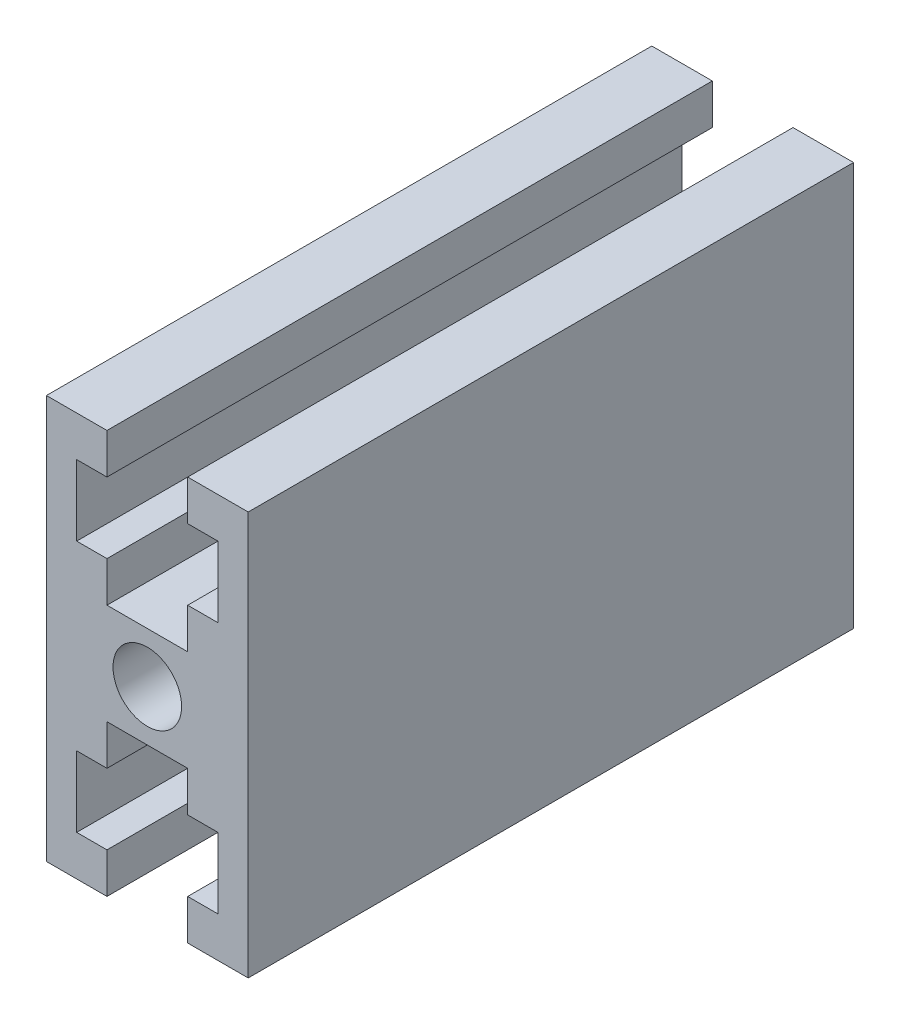
ISO-10303-21;
HEADER;
FILE_DESCRIPTION(('STEP AP214'),'2;1');
FILE_NAME('part.step','',(''),(''),'','','');
FILE_SCHEMA(('AUTOMOTIVE_DESIGN { 1 0 10303 214 1 1 1 1 }'));
ENDSEC;
DATA;
#1=APPLICATION_CONTEXT('core data for automotive mechanical design processes');
#2=APPLICATION_PROTOCOL_DEFINITION('international standard','automotive_design',2000,#1);
#3=PRODUCT_CONTEXT('',#1,'mechanical');
#4=PRODUCT('Part','Part','',(#3));
#5=PRODUCT_RELATED_PRODUCT_CATEGORY('part','',(#4));
#6=PRODUCT_DEFINITION_FORMATION('','',#4);
#7=PRODUCT_DEFINITION_CONTEXT('part definition',#1,'design');
#8=PRODUCT_DEFINITION('design','',#6,#7);
#9=PRODUCT_DEFINITION_SHAPE('','',#8);
#10=(LENGTH_UNIT() NAMED_UNIT(*) SI_UNIT(.MILLI.,.METRE.));
#11=(NAMED_UNIT(*) PLANE_ANGLE_UNIT() SI_UNIT($,.RADIAN.));
#12=(NAMED_UNIT(*) SI_UNIT($,.STERADIAN.) SOLID_ANGLE_UNIT());
#13=UNCERTAINTY_MEASURE_WITH_UNIT(LENGTH_MEASURE(1.E-05),#10,'distance_accuracy_value','');
#14=(GEOMETRIC_REPRESENTATION_CONTEXT(3) GLOBAL_UNCERTAINTY_ASSIGNED_CONTEXT((#13)) GLOBAL_UNIT_ASSIGNED_CONTEXT((#10,
#11,#12)) REPRESENTATION_CONTEXT('',''));
#15=CARTESIAN_POINT('',(0.,0.,0.));
#16=DIRECTION('',(0.,0.,1.));
#17=DIRECTION('',(1.,0.,0.));
#18=AXIS2_PLACEMENT_3D('',#15,#16,#17);
#19=CARTESIAN_POINT('',(0.,0.,60.));
#20=DIRECTION('',(0.,0.,1.));
#21=DIRECTION('',(1.,0.,0.));
#22=AXIS2_PLACEMENT_3D('',#19,#20,#21);
#23=PLANE('',#22);
#24=DIRECTION('',(0.,-1.,0.));
#25=VECTOR('',#24,1.);
#26=CARTESIAN_POINT('',(0.,0.,60.));
#27=LINE('',#26,#25);
#28=CARTESIAN_POINT('',(0.,0.,60.));
#29=VERTEX_POINT('',#28);
#30=CARTESIAN_POINT('',(0.,-40.,60.));
#31=VERTEX_POINT('',#30);
#32=EDGE_CURVE('E305',#29,#31,#27,.T.);
#33=ORIENTED_EDGE('',*,*,#32,.T.);
#34=DIRECTION('',(1.,0.,0.));
#35=VECTOR('',#34,1.);
#36=CARTESIAN_POINT('',(0.,-40.,60.));
#37=LINE('',#36,#35);
#38=CARTESIAN_POINT('',(6.,-40.,60.));
#39=VERTEX_POINT('',#38);
#40=EDGE_CURVE('E153',#31,#39,#37,.T.);
#41=ORIENTED_EDGE('',*,*,#40,.T.);
#42=DIRECTION('',(0.,1.,0.));
#43=VECTOR('',#42,1.);
#44=CARTESIAN_POINT('',(6.,-40.,60.));
#45=LINE('',#44,#43);
#46=CARTESIAN_POINT('',(6.,-36.,60.));
#47=VERTEX_POINT('',#46);
#48=EDGE_CURVE('E380',#39,#47,#45,.T.);
#49=ORIENTED_EDGE('',*,*,#48,.T.);
#50=DIRECTION('',(-1.,0.,0.));
#51=VECTOR('',#50,1.);
#52=CARTESIAN_POINT('',(6.,-36.,60.));
#53=LINE('',#52,#51);
#54=CARTESIAN_POINT('',(3.,-36.,60.));
#55=VERTEX_POINT('',#54);
#56=EDGE_CURVE('E399',#47,#55,#53,.T.);
#57=ORIENTED_EDGE('',*,*,#56,.T.);
#58=DIRECTION('',(0.,1.,0.));
#59=VECTOR('',#58,1.);
#60=CARTESIAN_POINT('',(3.,-36.,60.));
#61=LINE('',#60,#59);
#62=CARTESIAN_POINT('',(3.,-29.,60.));
#63=VERTEX_POINT('',#62);
#64=EDGE_CURVE('E396',#55,#63,#61,.T.);
#65=ORIENTED_EDGE('',*,*,#64,.T.);
#66=DIRECTION('',(1.,0.,0.));
#67=VECTOR('',#66,1.);
#68=CARTESIAN_POINT('',(3.,-29.,60.));
#69=LINE('',#68,#67);
#70=CARTESIAN_POINT('',(6.,-29.,60.));
#71=VERTEX_POINT('',#70);
#72=EDGE_CURVE('E398',#63,#71,#69,.T.);
#73=ORIENTED_EDGE('',*,*,#72,.T.);
#74=DIRECTION('',(0.,1.,0.));
#75=VECTOR('',#74,1.);
#76=CARTESIAN_POINT('',(6.,-29.,60.));
#77=LINE('',#76,#75);
#78=CARTESIAN_POINT('',(6.,-25.,60.));
#79=VERTEX_POINT('',#78);
#80=EDGE_CURVE('E401',#71,#79,#77,.T.);
#81=ORIENTED_EDGE('',*,*,#80,.T.);
#82=DIRECTION('',(1.,0.,0.));
#83=VECTOR('',#82,1.);
#84=CARTESIAN_POINT('',(6.,-25.,60.));
#85=LINE('',#84,#83);
#86=CARTESIAN_POINT('',(14.,-25.,60.));
#87=VERTEX_POINT('',#86);
#88=EDGE_CURVE('E407',#79,#87,#85,.T.);
#89=ORIENTED_EDGE('',*,*,#88,.T.);
#90=DIRECTION('',(0.,-1.,0.));
#91=VECTOR('',#90,1.);
#92=CARTESIAN_POINT('',(14.,-25.,60.));
#93=LINE('',#92,#91);
#94=CARTESIAN_POINT('',(14.,-29.,60.));
#95=VERTEX_POINT('',#94);
#96=EDGE_CURVE('E409',#87,#95,#93,.T.);
#97=ORIENTED_EDGE('',*,*,#96,.T.);
#98=DIRECTION('',(1.,0.,0.));
#99=VECTOR('',#98,1.);
#100=CARTESIAN_POINT('',(14.,-29.,60.));
#101=LINE('',#100,#99);
#102=CARTESIAN_POINT('',(17.,-29.,60.));
#103=VERTEX_POINT('',#102);
#104=EDGE_CURVE('E411',#95,#103,#101,.T.);
#105=ORIENTED_EDGE('',*,*,#104,.T.);
#106=DIRECTION('',(0.,-1.,0.));
#107=VECTOR('',#106,1.);
#108=CARTESIAN_POINT('',(17.,-29.,60.));
#109=LINE('',#108,#107);
#110=CARTESIAN_POINT('',(17.,-36.,60.));
#111=VERTEX_POINT('',#110);
#112=EDGE_CURVE('E413',#103,#111,#109,.T.);
#113=ORIENTED_EDGE('',*,*,#112,.T.);
#114=DIRECTION('',(-1.,0.,0.));
#115=VECTOR('',#114,1.);
#116=CARTESIAN_POINT('',(17.,-36.,60.));
#117=LINE('',#116,#115);
#118=CARTESIAN_POINT('',(14.,-36.,60.));
#119=VERTEX_POINT('',#118);
#120=EDGE_CURVE('E415',#111,#119,#117,.T.);
#121=ORIENTED_EDGE('',*,*,#120,.T.);
#122=DIRECTION('',(0.,-1.,0.));
#123=VECTOR('',#122,1.);
#124=CARTESIAN_POINT('',(14.,-36.,60.));
#125=LINE('',#124,#123);
#126=CARTESIAN_POINT('',(14.,-40.,60.));
#127=VERTEX_POINT('',#126);
#128=EDGE_CURVE('E417',#119,#127,#125,.T.);
#129=ORIENTED_EDGE('',*,*,#128,.T.);
#130=DIRECTION('',(1.,0.,0.));
#131=VECTOR('',#130,1.);
#132=CARTESIAN_POINT('',(14.,-40.,60.));
#133=LINE('',#132,#131);
#134=CARTESIAN_POINT('',(20.,-40.,60.));
#135=VERTEX_POINT('',#134);
#136=EDGE_CURVE('E419',#127,#135,#133,.T.);
#137=ORIENTED_EDGE('',*,*,#136,.T.);
#138=DIRECTION('',(0.,1.,0.));
#139=VECTOR('',#138,1.);
#140=CARTESIAN_POINT('',(20.,0.,60.));
#141=LINE('',#140,#139);
#142=CARTESIAN_POINT('',(20.,0.,60.));
#143=VERTEX_POINT('',#142);
#144=EDGE_CURVE('E421',#135,#143,#141,.T.);
#145=ORIENTED_EDGE('',*,*,#144,.T.);
#146=DIRECTION('',(-1.,0.,0.));
#147=VECTOR('',#146,1.);
#148=CARTESIAN_POINT('',(14.,0.,60.));
#149=LINE('',#148,#147);
#150=CARTESIAN_POINT('',(14.,0.,60.));
#151=VERTEX_POINT('',#150);
#152=EDGE_CURVE('E423',#143,#151,#149,.T.);
#153=ORIENTED_EDGE('',*,*,#152,.T.);
#154=DIRECTION('',(0.,-1.,0.));
#155=VECTOR('',#154,1.);
#156=CARTESIAN_POINT('',(14.,-4.,60.));
#157=LINE('',#156,#155);
#158=CARTESIAN_POINT('',(14.,-4.,60.));
#159=VERTEX_POINT('',#158);
#160=EDGE_CURVE('E425',#151,#159,#157,.T.);
#161=ORIENTED_EDGE('',*,*,#160,.T.);
#162=DIRECTION('',(1.,0.,0.));
#163=VECTOR('',#162,1.);
#164=CARTESIAN_POINT('',(17.,-4.,60.));
#165=LINE('',#164,#163);
#166=CARTESIAN_POINT('',(17.,-4.,60.));
#167=VERTEX_POINT('',#166);
#168=EDGE_CURVE('E427',#159,#167,#165,.T.);
#169=ORIENTED_EDGE('',*,*,#168,.T.);
#170=DIRECTION('',(0.,-1.,0.));
#171=VECTOR('',#170,1.);
#172=CARTESIAN_POINT('',(17.,-11.,60.));
#173=LINE('',#172,#171);
#174=CARTESIAN_POINT('',(17.,-11.,60.));
#175=VERTEX_POINT('',#174);
#176=EDGE_CURVE('E429',#167,#175,#173,.T.);
#177=ORIENTED_EDGE('',*,*,#176,.T.);
#178=DIRECTION('',(-1.,0.,0.));
#179=VECTOR('',#178,1.);
#180=CARTESIAN_POINT('',(14.,-11.,60.));
#181=LINE('',#180,#179);
#182=CARTESIAN_POINT('',(14.,-11.,60.));
#183=VERTEX_POINT('',#182);
#184=EDGE_CURVE('E431',#175,#183,#181,.T.);
#185=ORIENTED_EDGE('',*,*,#184,.T.);
#186=DIRECTION('',(0.,-1.,0.));
#187=VECTOR('',#186,1.);
#188=CARTESIAN_POINT('',(14.,-15.,60.));
#189=LINE('',#188,#187);
#190=CARTESIAN_POINT('',(14.,-15.,60.));
#191=VERTEX_POINT('',#190);
#192=EDGE_CURVE('E433',#183,#191,#189,.T.);
#193=ORIENTED_EDGE('',*,*,#192,.T.);
#194=DIRECTION('',(-1.,0.,0.));
#195=VECTOR('',#194,1.);
#196=CARTESIAN_POINT('',(6.,-15.,60.));
#197=LINE('',#196,#195);
#198=CARTESIAN_POINT('',(6.,-15.,60.));
#199=VERTEX_POINT('',#198);
#200=EDGE_CURVE('E435',#191,#199,#197,.T.);
#201=ORIENTED_EDGE('',*,*,#200,.T.);
#202=DIRECTION('',(0.,1.,0.));
#203=VECTOR('',#202,1.);
#204=CARTESIAN_POINT('',(6.,-11.,60.));
#205=LINE('',#204,#203);
#206=CARTESIAN_POINT('',(6.,-11.,60.));
#207=VERTEX_POINT('',#206);
#208=EDGE_CURVE('E437',#199,#207,#205,.T.);
#209=ORIENTED_EDGE('',*,*,#208,.T.);
#210=DIRECTION('',(-1.,0.,0.));
#211=VECTOR('',#210,1.);
#212=CARTESIAN_POINT('',(3.,-11.,60.));
#213=LINE('',#212,#211);
#214=CARTESIAN_POINT('',(3.,-11.,60.));
#215=VERTEX_POINT('',#214);
#216=EDGE_CURVE('E439',#207,#215,#213,.T.);
#217=ORIENTED_EDGE('',*,*,#216,.T.);
#218=DIRECTION('',(0.,1.,0.));
#219=VECTOR('',#218,1.);
#220=CARTESIAN_POINT('',(3.,-4.,60.));
#221=LINE('',#220,#219);
#222=CARTESIAN_POINT('',(3.,-4.,60.));
#223=VERTEX_POINT('',#222);
#224=EDGE_CURVE('E232',#215,#223,#221,.T.);
#225=ORIENTED_EDGE('',*,*,#224,.T.);
#226=DIRECTION('',(1.,0.,0.));
#227=VECTOR('',#226,1.);
#228=CARTESIAN_POINT('',(6.,-4.,60.));
#229=LINE('',#228,#227);
#230=CARTESIAN_POINT('',(6.,-4.,60.));
#231=VERTEX_POINT('',#230);
#232=EDGE_CURVE('E226',#223,#231,#229,.T.);
#233=ORIENTED_EDGE('',*,*,#232,.T.);
#234=DIRECTION('',(0.,1.,0.));
#235=VECTOR('',#234,1.);
#236=CARTESIAN_POINT('',(6.,0.,60.));
#237=LINE('',#236,#235);
#238=CARTESIAN_POINT('',(6.,0.,60.));
#239=VERTEX_POINT('',#238);
#240=EDGE_CURVE('E230',#231,#239,#237,.T.);
#241=ORIENTED_EDGE('',*,*,#240,.T.);
#242=DIRECTION('',(-1.,0.,0.));
#243=VECTOR('',#242,1.);
#244=CARTESIAN_POINT('',(0.,0.,60.));
#245=LINE('',#244,#243);
#246=EDGE_CURVE('E50',#239,#29,#245,.T.);
#247=ORIENTED_EDGE('',*,*,#246,.T.);
#248=EDGE_LOOP('',(#33,#41,#49,#57,#65,#73,#81,#89,#97,#105,#113,#121,#129,#137,#145,#153,#161,
#169,#177,#185,#193,#201,#209,#217,#225,#233,#241,#247));
#249=FACE_BOUND('',#248,.T.);
#250=CARTESIAN_POINT('',(10.,-20.,60.));
#251=DIRECTION('',(0.,0.,1.));
#252=DIRECTION('',(-1.,0.,0.));
#253=AXIS2_PLACEMENT_3D('',#250,#251,#252);
#254=CIRCLE('',#253,3.4);
#255=CARTESIAN_POINT('',(6.6,-20.,60.));
#256=VERTEX_POINT('',#255);
#257=EDGE_CURVE('E254',#256,#256,#254,.T.);
#258=ORIENTED_EDGE('',*,*,#257,.F.);
#259=EDGE_LOOP('',(#258));
#260=FACE_BOUND('',#259,.T.);
#261=ADVANCED_FACE('F33',(#249,#260),#23,.T.);
#262=CARTESIAN_POINT('',(0.,0.,0.));
#263=DIRECTION('',(0.,0.,1.));
#264=DIRECTION('',(1.,0.,0.));
#265=AXIS2_PLACEMENT_3D('',#262,#263,#264);
#266=PLANE('',#265);
#267=DIRECTION('',(0.,-1.,0.));
#268=VECTOR('',#267,1.);
#269=CARTESIAN_POINT('',(0.,0.,0.));
#270=LINE('',#269,#268);
#271=CARTESIAN_POINT('',(0.,0.,0.));
#272=VERTEX_POINT('',#271);
#273=CARTESIAN_POINT('',(0.,-40.,0.));
#274=VERTEX_POINT('',#273);
#275=EDGE_CURVE('E250',#272,#274,#270,.T.);
#276=ORIENTED_EDGE('',*,*,#275,.F.);
#277=DIRECTION('',(-1.,0.,0.));
#278=VECTOR('',#277,1.);
#279=CARTESIAN_POINT('',(0.,0.,0.));
#280=LINE('',#279,#278);
#281=CARTESIAN_POINT('',(6.,0.,0.));
#282=VERTEX_POINT('',#281);
#283=EDGE_CURVE('E145',#282,#272,#280,.T.);
#284=ORIENTED_EDGE('',*,*,#283,.F.);
#285=DIRECTION('',(0.,1.,0.));
#286=VECTOR('',#285,1.);
#287=CARTESIAN_POINT('',(6.,0.,0.));
#288=LINE('',#287,#286);
#289=CARTESIAN_POINT('',(6.,-4.,0.));
#290=VERTEX_POINT('',#289);
#291=EDGE_CURVE('E139',#290,#282,#288,.T.);
#292=ORIENTED_EDGE('',*,*,#291,.F.);
#293=DIRECTION('',(1.,0.,0.));
#294=VECTOR('',#293,1.);
#295=CARTESIAN_POINT('',(6.,-4.,0.));
#296=LINE('',#295,#294);
#297=CARTESIAN_POINT('',(3.,-4.,0.));
#298=VERTEX_POINT('',#297);
#299=EDGE_CURVE('E240',#298,#290,#296,.T.);
#300=ORIENTED_EDGE('',*,*,#299,.F.);
#301=DIRECTION('',(0.,1.,0.));
#302=VECTOR('',#301,1.);
#303=CARTESIAN_POINT('',(3.,-4.,0.));
#304=LINE('',#303,#302);
#305=CARTESIAN_POINT('',(3.,-11.,0.));
#306=VERTEX_POINT('',#305);
#307=EDGE_CURVE('E300',#306,#298,#304,.T.);
#308=ORIENTED_EDGE('',*,*,#307,.F.);
#309=DIRECTION('',(-1.,0.,0.));
#310=VECTOR('',#309,1.);
#311=CARTESIAN_POINT('',(3.,-11.,0.));
#312=LINE('',#311,#310);
#313=CARTESIAN_POINT('',(6.,-11.,0.));
#314=VERTEX_POINT('',#313);
#315=EDGE_CURVE('E298',#314,#306,#312,.T.);
#316=ORIENTED_EDGE('',*,*,#315,.F.);
#317=DIRECTION('',(0.,1.,0.));
#318=VECTOR('',#317,1.);
#319=CARTESIAN_POINT('',(6.,-11.,0.));
#320=LINE('',#319,#318);
#321=CARTESIAN_POINT('',(6.,-15.,0.));
#322=VERTEX_POINT('',#321);
#323=EDGE_CURVE('E296',#322,#314,#320,.T.);
#324=ORIENTED_EDGE('',*,*,#323,.F.);
#325=DIRECTION('',(-1.,0.,0.));
#326=VECTOR('',#325,1.);
#327=CARTESIAN_POINT('',(6.,-15.,0.));
#328=LINE('',#327,#326);
#329=CARTESIAN_POINT('',(14.,-15.,0.));
#330=VERTEX_POINT('',#329);
#331=EDGE_CURVE('E294',#330,#322,#328,.T.);
#332=ORIENTED_EDGE('',*,*,#331,.F.);
#333=DIRECTION('',(0.,-1.,0.));
#334=VECTOR('',#333,1.);
#335=CARTESIAN_POINT('',(14.,-15.,0.));
#336=LINE('',#335,#334);
#337=CARTESIAN_POINT('',(14.,-11.,0.));
#338=VERTEX_POINT('',#337);
#339=EDGE_CURVE('E292',#338,#330,#336,.T.);
#340=ORIENTED_EDGE('',*,*,#339,.F.);
#341=DIRECTION('',(-1.,0.,0.));
#342=VECTOR('',#341,1.);
#343=CARTESIAN_POINT('',(14.,-11.,0.));
#344=LINE('',#343,#342);
#345=CARTESIAN_POINT('',(17.,-11.,0.));
#346=VERTEX_POINT('',#345);
#347=EDGE_CURVE('E290',#346,#338,#344,.T.);
#348=ORIENTED_EDGE('',*,*,#347,.F.);
#349=DIRECTION('',(0.,-1.,0.));
#350=VECTOR('',#349,1.);
#351=CARTESIAN_POINT('',(17.,-11.,0.));
#352=LINE('',#351,#350);
#353=CARTESIAN_POINT('',(17.,-4.,0.));
#354=VERTEX_POINT('',#353);
#355=EDGE_CURVE('E288',#354,#346,#352,.T.);
#356=ORIENTED_EDGE('',*,*,#355,.F.);
#357=DIRECTION('',(1.,0.,0.));
#358=VECTOR('',#357,1.);
#359=CARTESIAN_POINT('',(17.,-4.,0.));
#360=LINE('',#359,#358);
#361=CARTESIAN_POINT('',(14.,-4.,0.));
#362=VERTEX_POINT('',#361);
#363=EDGE_CURVE('E286',#362,#354,#360,.T.);
#364=ORIENTED_EDGE('',*,*,#363,.F.);
#365=DIRECTION('',(0.,-1.,0.));
#366=VECTOR('',#365,1.);
#367=CARTESIAN_POINT('',(14.,-4.,0.));
#368=LINE('',#367,#366);
#369=CARTESIAN_POINT('',(14.,0.,0.));
#370=VERTEX_POINT('',#369);
#371=EDGE_CURVE('E284',#370,#362,#368,.T.);
#372=ORIENTED_EDGE('',*,*,#371,.F.);
#373=DIRECTION('',(-1.,0.,0.));
#374=VECTOR('',#373,1.);
#375=CARTESIAN_POINT('',(14.,0.,0.));
#376=LINE('',#375,#374);
#377=CARTESIAN_POINT('',(20.,0.,0.));
#378=VERTEX_POINT('',#377);
#379=EDGE_CURVE('E282',#378,#370,#376,.T.);
#380=ORIENTED_EDGE('',*,*,#379,.F.);
#381=DIRECTION('',(0.,1.,0.));
#382=VECTOR('',#381,1.);
#383=CARTESIAN_POINT('',(20.,0.,0.));
#384=LINE('',#383,#382);
#385=CARTESIAN_POINT('',(20.,-40.,0.));
#386=VERTEX_POINT('',#385);
#387=EDGE_CURVE('E280',#386,#378,#384,.T.);
#388=ORIENTED_EDGE('',*,*,#387,.F.);
#389=DIRECTION('',(1.,0.,0.));
#390=VECTOR('',#389,1.);
#391=CARTESIAN_POINT('',(14.,-40.,0.));
#392=LINE('',#391,#390);
#393=CARTESIAN_POINT('',(14.,-40.,0.));
#394=VERTEX_POINT('',#393);
#395=EDGE_CURVE('E278',#394,#386,#392,.T.);
#396=ORIENTED_EDGE('',*,*,#395,.F.);
#397=DIRECTION('',(0.,-1.,0.));
#398=VECTOR('',#397,1.);
#399=CARTESIAN_POINT('',(14.,-36.,0.));
#400=LINE('',#399,#398);
#401=CARTESIAN_POINT('',(14.,-36.,0.));
#402=VERTEX_POINT('',#401);
#403=EDGE_CURVE('E276',#402,#394,#400,.T.);
#404=ORIENTED_EDGE('',*,*,#403,.F.);
#405=DIRECTION('',(-1.,0.,0.));
#406=VECTOR('',#405,1.);
#407=CARTESIAN_POINT('',(17.,-36.,0.));
#408=LINE('',#407,#406);
#409=CARTESIAN_POINT('',(17.,-36.,0.));
#410=VERTEX_POINT('',#409);
#411=EDGE_CURVE('E274',#410,#402,#408,.T.);
#412=ORIENTED_EDGE('',*,*,#411,.F.);
#413=DIRECTION('',(0.,-1.,0.));
#414=VECTOR('',#413,1.);
#415=CARTESIAN_POINT('',(17.,-29.,0.));
#416=LINE('',#415,#414);
#417=CARTESIAN_POINT('',(17.,-29.,0.));
#418=VERTEX_POINT('',#417);
#419=EDGE_CURVE('E272',#418,#410,#416,.T.);
#420=ORIENTED_EDGE('',*,*,#419,.F.);
#421=DIRECTION('',(1.,0.,0.));
#422=VECTOR('',#421,1.);
#423=CARTESIAN_POINT('',(14.,-29.,0.));
#424=LINE('',#423,#422);
#425=CARTESIAN_POINT('',(14.,-29.,0.));
#426=VERTEX_POINT('',#425);
#427=EDGE_CURVE('E270',#426,#418,#424,.T.);
#428=ORIENTED_EDGE('',*,*,#427,.F.);
#429=DIRECTION('',(0.,-1.,0.));
#430=VECTOR('',#429,1.);
#431=CARTESIAN_POINT('',(14.,-25.,0.));
#432=LINE('',#431,#430);
#433=CARTESIAN_POINT('',(14.,-25.,0.));
#434=VERTEX_POINT('',#433);
#435=EDGE_CURVE('E268',#434,#426,#432,.T.);
#436=ORIENTED_EDGE('',*,*,#435,.F.);
#437=DIRECTION('',(1.,0.,0.));
#438=VECTOR('',#437,1.);
#439=CARTESIAN_POINT('',(6.,-25.,0.));
#440=LINE('',#439,#438);
#441=CARTESIAN_POINT('',(6.,-25.,0.));
#442=VERTEX_POINT('',#441);
#443=EDGE_CURVE('E266',#442,#434,#440,.T.);
#444=ORIENTED_EDGE('',*,*,#443,.F.);
#445=DIRECTION('',(0.,1.,0.));
#446=VECTOR('',#445,1.);
#447=CARTESIAN_POINT('',(6.,-29.,0.));
#448=LINE('',#447,#446);
#449=CARTESIAN_POINT('',(6.,-29.,0.));
#450=VERTEX_POINT('',#449);
#451=EDGE_CURVE('E264',#450,#442,#448,.T.);
#452=ORIENTED_EDGE('',*,*,#451,.F.);
#453=DIRECTION('',(1.,0.,0.));
#454=VECTOR('',#453,1.);
#455=CARTESIAN_POINT('',(3.,-29.,0.));
#456=LINE('',#455,#454);
#457=CARTESIAN_POINT('',(3.,-29.,0.));
#458=VERTEX_POINT('',#457);
#459=EDGE_CURVE('E262',#458,#450,#456,.T.);
#460=ORIENTED_EDGE('',*,*,#459,.F.);
#461=DIRECTION('',(0.,1.,0.));
#462=VECTOR('',#461,1.);
#463=CARTESIAN_POINT('',(3.,-36.,0.));
#464=LINE('',#463,#462);
#465=CARTESIAN_POINT('',(3.,-36.,0.));
#466=VERTEX_POINT('',#465);
#467=EDGE_CURVE('E260',#466,#458,#464,.T.);
#468=ORIENTED_EDGE('',*,*,#467,.F.);
#469=DIRECTION('',(-1.,0.,0.));
#470=VECTOR('',#469,1.);
#471=CARTESIAN_POINT('',(6.,-36.,0.));
#472=LINE('',#471,#470);
#473=CARTESIAN_POINT('',(6.,-36.,0.));
#474=VERTEX_POINT('',#473);
#475=EDGE_CURVE('E258',#474,#466,#472,.T.);
#476=ORIENTED_EDGE('',*,*,#475,.F.);
#477=DIRECTION('',(0.,1.,0.));
#478=VECTOR('',#477,1.);
#479=CARTESIAN_POINT('',(6.,-40.,0.));
#480=LINE('',#479,#478);
#481=CARTESIAN_POINT('',(6.,-40.,0.));
#482=VERTEX_POINT('',#481);
#483=EDGE_CURVE('E256',#482,#474,#480,.T.);
#484=ORIENTED_EDGE('',*,*,#483,.F.);
#485=DIRECTION('',(1.,0.,0.));
#486=VECTOR('',#485,1.);
#487=CARTESIAN_POINT('',(0.,-40.,0.));
#488=LINE('',#487,#486);
#489=EDGE_CURVE('E253',#274,#482,#488,.T.);
#490=ORIENTED_EDGE('',*,*,#489,.F.);
#491=EDGE_LOOP('',(#276,#284,#292,#300,#308,#316,#324,#332,#340,#348,#356,#364,#372,#380,#388,
#396,#404,#412,#420,#428,#436,#444,#452,#460,#468,#476,#484,#490));
#492=FACE_BOUND('',#491,.T.);
#493=CARTESIAN_POINT('',(10.,-20.,0.));
#494=DIRECTION('',(0.,0.,1.));
#495=DIRECTION('',(-1.,0.,0.));
#496=AXIS2_PLACEMENT_3D('',#493,#494,#495);
#497=CIRCLE('',#496,3.4);
#498=CARTESIAN_POINT('',(6.6,-20.,0.));
#499=VERTEX_POINT('',#498);
#500=EDGE_CURVE('E794',#499,#499,#497,.T.);
#501=ORIENTED_EDGE('',*,*,#500,.T.);
#502=EDGE_LOOP('',(#501));
#503=FACE_BOUND('',#502,.T.);
#504=ADVANCED_FACE('F384',(#492,#503),#266,.F.);
#505=CARTESIAN_POINT('',(0.,0.,60.));
#506=DIRECTION('',(1.,0.,0.));
#507=DIRECTION('',(0.,0.,-1.));
#508=AXIS2_PLACEMENT_3D('',#505,#506,#507);
#509=PLANE('',#508);
#510=ORIENTED_EDGE('',*,*,#275,.T.);
#511=DIRECTION('',(0.,0.,-1.));
#512=VECTOR('',#511,1.);
#513=CARTESIAN_POINT('',(0.,-40.,60.));
#514=LINE('',#513,#512);
#515=EDGE_CURVE('E11',#31,#274,#514,.T.);
#516=ORIENTED_EDGE('',*,*,#515,.F.);
#517=ORIENTED_EDGE('',*,*,#32,.F.);
#518=DIRECTION('',(0.,0.,-1.));
#519=VECTOR('',#518,1.);
#520=CARTESIAN_POINT('',(0.,0.,60.));
#521=LINE('',#520,#519);
#522=EDGE_CURVE('E246',#29,#272,#521,.T.);
#523=ORIENTED_EDGE('',*,*,#522,.T.);
#524=EDGE_LOOP('',(#510,#516,#517,#523));
#525=FACE_BOUND('',#524,.T.);
#526=ADVANCED_FACE('F35',(#525),#509,.F.);
#527=CARTESIAN_POINT('',(0.,-40.,60.));
#528=DIRECTION('',(0.,1.,0.));
#529=DIRECTION('',(0.,0.,1.));
#530=AXIS2_PLACEMENT_3D('',#527,#528,#529);
#531=PLANE('',#530);
#532=ORIENTED_EDGE('',*,*,#489,.T.);
#533=DIRECTION('',(0.,0.,-1.));
#534=VECTOR('',#533,1.);
#535=CARTESIAN_POINT('',(6.,-40.,60.));
#536=LINE('',#535,#534);
#537=EDGE_CURVE('E42',#39,#482,#536,.T.);
#538=ORIENTED_EDGE('',*,*,#537,.F.);
#539=ORIENTED_EDGE('',*,*,#40,.F.);
#540=ORIENTED_EDGE('',*,*,#515,.T.);
#541=EDGE_LOOP('',(#532,#538,#539,#540));
#542=FACE_BOUND('',#541,.T.);
#543=ADVANCED_FACE('F473',(#542),#531,.F.);
#544=CARTESIAN_POINT('',(6.,-40.,60.));
#545=DIRECTION('',(-1.,0.,0.));
#546=DIRECTION('',(0.,0.,1.));
#547=AXIS2_PLACEMENT_3D('',#544,#545,#546);
#548=PLANE('',#547);
#549=ORIENTED_EDGE('',*,*,#483,.T.);
#550=DIRECTION('',(0.,0.,-1.));
#551=VECTOR('',#550,1.);
#552=CARTESIAN_POINT('',(6.,-36.,60.));
#553=LINE('',#552,#551);
#554=EDGE_CURVE('E372',#47,#474,#553,.T.);
#555=ORIENTED_EDGE('',*,*,#554,.F.);
#556=ORIENTED_EDGE('',*,*,#48,.F.);
#557=ORIENTED_EDGE('',*,*,#537,.T.);
#558=EDGE_LOOP('',(#549,#555,#556,#557));
#559=FACE_BOUND('',#558,.T.);
#560=ADVANCED_FACE('F378',(#559),#548,.F.);
#561=CARTESIAN_POINT('',(6.,-36.,60.));
#562=DIRECTION('',(0.,-1.,0.));
#563=DIRECTION('',(0.,0.,-1.));
#564=AXIS2_PLACEMENT_3D('',#561,#562,#563);
#565=PLANE('',#564);
#566=ORIENTED_EDGE('',*,*,#475,.T.);
#567=DIRECTION('',(0.,0.,-1.));
#568=VECTOR('',#567,1.);
#569=CARTESIAN_POINT('',(3.,-36.,60.));
#570=LINE('',#569,#568);
#571=EDGE_CURVE('E369',#55,#466,#570,.T.);
#572=ORIENTED_EDGE('',*,*,#571,.F.);
#573=ORIENTED_EDGE('',*,*,#56,.F.);
#574=ORIENTED_EDGE('',*,*,#554,.T.);
#575=EDGE_LOOP('',(#566,#572,#573,#574));
#576=FACE_BOUND('',#575,.T.);
#577=ADVANCED_FACE('F390',(#576),#565,.F.);
#578=CARTESIAN_POINT('',(3.,-36.,60.));
#579=DIRECTION('',(-1.,0.,0.));
#580=DIRECTION('',(0.,-1.,0.));
#581=AXIS2_PLACEMENT_3D('',#578,#579,#580);
#582=PLANE('',#581);
#583=ORIENTED_EDGE('',*,*,#467,.T.);
#584=DIRECTION('',(0.,0.,-1.));
#585=VECTOR('',#584,1.);
#586=CARTESIAN_POINT('',(3.,-29.,60.));
#587=LINE('',#586,#585);
#588=EDGE_CURVE('E366',#63,#458,#587,.T.);
#589=ORIENTED_EDGE('',*,*,#588,.F.);
#590=ORIENTED_EDGE('',*,*,#64,.F.);
#591=ORIENTED_EDGE('',*,*,#571,.T.);
#592=EDGE_LOOP('',(#583,#589,#590,#591));
#593=FACE_BOUND('',#592,.T.);
#594=ADVANCED_FACE('F394',(#593),#582,.F.);
#595=CARTESIAN_POINT('',(3.,-29.,60.));
#596=DIRECTION('',(0.,1.,0.));
#597=DIRECTION('',(0.,0.,1.));
#598=AXIS2_PLACEMENT_3D('',#595,#596,#597);
#599=PLANE('',#598);
#600=ORIENTED_EDGE('',*,*,#459,.T.);
#601=DIRECTION('',(0.,0.,-1.));
#602=VECTOR('',#601,1.);
#603=CARTESIAN_POINT('',(6.,-29.,60.));
#604=LINE('',#603,#602);
#605=EDGE_CURVE('E363',#71,#450,#604,.T.);
#606=ORIENTED_EDGE('',*,*,#605,.F.);
#607=ORIENTED_EDGE('',*,*,#72,.F.);
#608=ORIENTED_EDGE('',*,*,#588,.T.);
#609=EDGE_LOOP('',(#600,#606,#607,#608));
#610=FACE_BOUND('',#609,.T.);
#611=ADVANCED_FACE('F486',(#610),#599,.F.);
#612=CARTESIAN_POINT('',(6.,-29.,60.));
#613=DIRECTION('',(-1.,0.,0.));
#614=DIRECTION('',(0.,-1.,0.));
#615=AXIS2_PLACEMENT_3D('',#612,#613,#614);
#616=PLANE('',#615);
#617=ORIENTED_EDGE('',*,*,#451,.T.);
#618=DIRECTION('',(0.,0.,-1.));
#619=VECTOR('',#618,1.);
#620=CARTESIAN_POINT('',(6.,-25.,60.));
#621=LINE('',#620,#619);
#622=EDGE_CURVE('E360',#79,#442,#621,.T.);
#623=ORIENTED_EDGE('',*,*,#622,.F.);
#624=ORIENTED_EDGE('',*,*,#80,.F.);
#625=ORIENTED_EDGE('',*,*,#605,.T.);
#626=EDGE_LOOP('',(#617,#623,#624,#625));
#627=FACE_BOUND('',#626,.T.);
#628=ADVANCED_FACE('F489',(#627),#616,.F.);
#629=CARTESIAN_POINT('',(6.,-25.,60.));
#630=DIRECTION('',(0.,1.,0.));
#631=DIRECTION('',(0.,0.,1.));
#632=AXIS2_PLACEMENT_3D('',#629,#630,#631);
#633=PLANE('',#632);
#634=ORIENTED_EDGE('',*,*,#443,.T.);
#635=DIRECTION('',(0.,0.,-1.));
#636=VECTOR('',#635,1.);
#637=CARTESIAN_POINT('',(14.,-25.,60.));
#638=LINE('',#637,#636);
#639=EDGE_CURVE('E357',#87,#434,#638,.T.);
#640=ORIENTED_EDGE('',*,*,#639,.F.);
#641=ORIENTED_EDGE('',*,*,#88,.F.);
#642=ORIENTED_EDGE('',*,*,#622,.T.);
#643=EDGE_LOOP('',(#634,#640,#641,#642));
#644=FACE_BOUND('',#643,.T.);
#645=ADVANCED_FACE('F493',(#644),#633,.F.);
#646=CARTESIAN_POINT('',(14.,-25.,60.));
#647=DIRECTION('',(1.,0.,0.));
#648=DIRECTION('',(0.,1.,0.));
#649=AXIS2_PLACEMENT_3D('',#646,#647,#648);
#650=PLANE('',#649);
#651=ORIENTED_EDGE('',*,*,#435,.T.);
#652=DIRECTION('',(0.,0.,-1.));
#653=VECTOR('',#652,1.);
#654=CARTESIAN_POINT('',(14.,-29.,60.));
#655=LINE('',#654,#653);
#656=EDGE_CURVE('E354',#95,#426,#655,.T.);
#657=ORIENTED_EDGE('',*,*,#656,.F.);
#658=ORIENTED_EDGE('',*,*,#96,.F.);
#659=ORIENTED_EDGE('',*,*,#639,.T.);
#660=EDGE_LOOP('',(#651,#657,#658,#659));
#661=FACE_BOUND('',#660,.T.);
#662=ADVANCED_FACE('F497',(#661),#650,.F.);
#663=CARTESIAN_POINT('',(14.,-29.,60.));
#664=DIRECTION('',(0.,1.,0.));
#665=DIRECTION('',(0.,0.,1.));
#666=AXIS2_PLACEMENT_3D('',#663,#664,#665);
#667=PLANE('',#666);
#668=ORIENTED_EDGE('',*,*,#427,.T.);
#669=DIRECTION('',(0.,0.,-1.));
#670=VECTOR('',#669,1.);
#671=CARTESIAN_POINT('',(17.,-29.,60.));
#672=LINE('',#671,#670);
#673=EDGE_CURVE('E351',#103,#418,#672,.T.);
#674=ORIENTED_EDGE('',*,*,#673,.F.);
#675=ORIENTED_EDGE('',*,*,#104,.F.);
#676=ORIENTED_EDGE('',*,*,#656,.T.);
#677=EDGE_LOOP('',(#668,#674,#675,#676));
#678=FACE_BOUND('',#677,.T.);
#679=ADVANCED_FACE('F501',(#678),#667,.F.);
#680=CARTESIAN_POINT('',(17.,-29.,60.));
#681=DIRECTION('',(1.,0.,0.));
#682=DIRECTION('',(0.,0.,-1.));
#683=AXIS2_PLACEMENT_3D('',#680,#681,#682);
#684=PLANE('',#683);
#685=ORIENTED_EDGE('',*,*,#419,.T.);
#686=DIRECTION('',(0.,0.,-1.));
#687=VECTOR('',#686,1.);
#688=CARTESIAN_POINT('',(17.,-36.,60.));
#689=LINE('',#688,#687);
#690=EDGE_CURVE('E348',#111,#410,#689,.T.);
#691=ORIENTED_EDGE('',*,*,#690,.F.);
#692=ORIENTED_EDGE('',*,*,#112,.F.);
#693=ORIENTED_EDGE('',*,*,#673,.T.);
#694=EDGE_LOOP('',(#685,#691,#692,#693));
#695=FACE_BOUND('',#694,.T.);
#696=ADVANCED_FACE('F505',(#695),#684,.F.);
#697=CARTESIAN_POINT('',(17.,-36.,60.));
#698=DIRECTION('',(0.,-1.,0.));
#699=DIRECTION('',(1.,0.,0.));
#700=AXIS2_PLACEMENT_3D('',#697,#698,#699);
#701=PLANE('',#700);
#702=ORIENTED_EDGE('',*,*,#411,.T.);
#703=DIRECTION('',(0.,0.,-1.));
#704=VECTOR('',#703,1.);
#705=CARTESIAN_POINT('',(14.,-36.,60.));
#706=LINE('',#705,#704);
#707=EDGE_CURVE('E345',#119,#402,#706,.T.);
#708=ORIENTED_EDGE('',*,*,#707,.F.);
#709=ORIENTED_EDGE('',*,*,#120,.F.);
#710=ORIENTED_EDGE('',*,*,#690,.T.);
#711=EDGE_LOOP('',(#702,#708,#709,#710));
#712=FACE_BOUND('',#711,.T.);
#713=ADVANCED_FACE('F509',(#712),#701,.F.);
#714=CARTESIAN_POINT('',(14.,-36.,60.));
#715=DIRECTION('',(1.,0.,0.));
#716=DIRECTION('',(0.,0.,-1.));
#717=AXIS2_PLACEMENT_3D('',#714,#715,#716);
#718=PLANE('',#717);
#719=ORIENTED_EDGE('',*,*,#403,.T.);
#720=DIRECTION('',(0.,0.,-1.));
#721=VECTOR('',#720,1.);
#722=CARTESIAN_POINT('',(14.,-40.,60.));
#723=LINE('',#722,#721);
#724=EDGE_CURVE('E342',#127,#394,#723,.T.);
#725=ORIENTED_EDGE('',*,*,#724,.F.);
#726=ORIENTED_EDGE('',*,*,#128,.F.);
#727=ORIENTED_EDGE('',*,*,#707,.T.);
#728=EDGE_LOOP('',(#719,#725,#726,#727));
#729=FACE_BOUND('',#728,.T.);
#730=ADVANCED_FACE('F513',(#729),#718,.F.);
#731=CARTESIAN_POINT('',(14.,-40.,60.));
#732=DIRECTION('',(0.,1.,0.));
#733=DIRECTION('',(0.,0.,1.));
#734=AXIS2_PLACEMENT_3D('',#731,#732,#733);
#735=PLANE('',#734);
#736=ORIENTED_EDGE('',*,*,#395,.T.);
#737=DIRECTION('',(0.,0.,-1.));
#738=VECTOR('',#737,1.);
#739=CARTESIAN_POINT('',(20.,-40.,60.));
#740=LINE('',#739,#738);
#741=EDGE_CURVE('E339',#135,#386,#740,.T.);
#742=ORIENTED_EDGE('',*,*,#741,.F.);
#743=ORIENTED_EDGE('',*,*,#136,.F.);
#744=ORIENTED_EDGE('',*,*,#724,.T.);
#745=EDGE_LOOP('',(#736,#742,#743,#744));
#746=FACE_BOUND('',#745,.T.);
#747=ADVANCED_FACE('F517',(#746),#735,.F.);
#748=CARTESIAN_POINT('',(20.,0.,60.));
#749=DIRECTION('',(-1.,0.,0.));
#750=DIRECTION('',(0.,0.,1.));
#751=AXIS2_PLACEMENT_3D('',#748,#749,#750);
#752=PLANE('',#751);
#753=ORIENTED_EDGE('',*,*,#387,.T.);
#754=DIRECTION('',(0.,0.,-1.));
#755=VECTOR('',#754,1.);
#756=CARTESIAN_POINT('',(20.,0.,60.));
#757=LINE('',#756,#755);
#758=EDGE_CURVE('E336',#143,#378,#757,.T.);
#759=ORIENTED_EDGE('',*,*,#758,.F.);
#760=ORIENTED_EDGE('',*,*,#144,.F.);
#761=ORIENTED_EDGE('',*,*,#741,.T.);
#762=EDGE_LOOP('',(#753,#759,#760,#761));
#763=FACE_BOUND('',#762,.T.);
#764=ADVANCED_FACE('F521',(#763),#752,.F.);
#765=CARTESIAN_POINT('',(14.,0.,60.));
#766=DIRECTION('',(0.,-1.,0.));
#767=DIRECTION('',(0.,0.,-1.));
#768=AXIS2_PLACEMENT_3D('',#765,#766,#767);
#769=PLANE('',#768);
#770=ORIENTED_EDGE('',*,*,#379,.T.);
#771=DIRECTION('',(0.,0.,-1.));
#772=VECTOR('',#771,1.);
#773=CARTESIAN_POINT('',(14.,0.,60.));
#774=LINE('',#773,#772);
#775=EDGE_CURVE('E333',#151,#370,#774,.T.);
#776=ORIENTED_EDGE('',*,*,#775,.F.);
#777=ORIENTED_EDGE('',*,*,#152,.F.);
#778=ORIENTED_EDGE('',*,*,#758,.T.);
#779=EDGE_LOOP('',(#770,#776,#777,#778));
#780=FACE_BOUND('',#779,.T.);
#781=ADVANCED_FACE('F525',(#780),#769,.F.);
#782=CARTESIAN_POINT('',(14.,-4.,60.));
#783=DIRECTION('',(1.,0.,0.));
#784=DIRECTION('',(0.,0.,-1.));
#785=AXIS2_PLACEMENT_3D('',#782,#783,#784);
#786=PLANE('',#785);
#787=ORIENTED_EDGE('',*,*,#371,.T.);
#788=DIRECTION('',(0.,0.,-1.));
#789=VECTOR('',#788,1.);
#790=CARTESIAN_POINT('',(14.,-4.,60.));
#791=LINE('',#790,#789);
#792=EDGE_CURVE('E330',#159,#362,#791,.T.);
#793=ORIENTED_EDGE('',*,*,#792,.F.);
#794=ORIENTED_EDGE('',*,*,#160,.F.);
#795=ORIENTED_EDGE('',*,*,#775,.T.);
#796=EDGE_LOOP('',(#787,#793,#794,#795));
#797=FACE_BOUND('',#796,.T.);
#798=ADVANCED_FACE('F529',(#797),#786,.F.);
#799=CARTESIAN_POINT('',(17.,-4.,60.));
#800=DIRECTION('',(0.,1.,0.));
#801=DIRECTION('',(-1.,0.,0.));
#802=AXIS2_PLACEMENT_3D('',#799,#800,#801);
#803=PLANE('',#802);
#804=ORIENTED_EDGE('',*,*,#363,.T.);
#805=DIRECTION('',(0.,0.,-1.));
#806=VECTOR('',#805,1.);
#807=CARTESIAN_POINT('',(17.,-4.,60.));
#808=LINE('',#807,#806);
#809=EDGE_CURVE('E327',#167,#354,#808,.T.);
#810=ORIENTED_EDGE('',*,*,#809,.F.);
#811=ORIENTED_EDGE('',*,*,#168,.F.);
#812=ORIENTED_EDGE('',*,*,#792,.T.);
#813=EDGE_LOOP('',(#804,#810,#811,#812));
#814=FACE_BOUND('',#813,.T.);
#815=ADVANCED_FACE('F533',(#814),#803,.F.);
#816=CARTESIAN_POINT('',(17.,-11.,60.));
#817=DIRECTION('',(1.,0.,0.));
#818=DIRECTION('',(0.,0.,-1.));
#819=AXIS2_PLACEMENT_3D('',#816,#817,#818);
#820=PLANE('',#819);
#821=ORIENTED_EDGE('',*,*,#355,.T.);
#822=DIRECTION('',(0.,0.,-1.));
#823=VECTOR('',#822,1.);
#824=CARTESIAN_POINT('',(17.,-11.,60.));
#825=LINE('',#824,#823);
#826=EDGE_CURVE('E324',#175,#346,#825,.T.);
#827=ORIENTED_EDGE('',*,*,#826,.F.);
#828=ORIENTED_EDGE('',*,*,#176,.F.);
#829=ORIENTED_EDGE('',*,*,#809,.T.);
#830=EDGE_LOOP('',(#821,#827,#828,#829));
#831=FACE_BOUND('',#830,.T.);
#832=ADVANCED_FACE('F537',(#831),#820,.F.);
#833=CARTESIAN_POINT('',(14.,-11.,60.));
#834=DIRECTION('',(0.,-1.,0.));
#835=DIRECTION('',(0.,0.,-1.));
#836=AXIS2_PLACEMENT_3D('',#833,#834,#835);
#837=PLANE('',#836);
#838=ORIENTED_EDGE('',*,*,#347,.T.);
#839=DIRECTION('',(0.,0.,-1.));
#840=VECTOR('',#839,1.);
#841=CARTESIAN_POINT('',(14.,-11.,60.));
#842=LINE('',#841,#840);
#843=EDGE_CURVE('E321',#183,#338,#842,.T.);
#844=ORIENTED_EDGE('',*,*,#843,.F.);
#845=ORIENTED_EDGE('',*,*,#184,.F.);
#846=ORIENTED_EDGE('',*,*,#826,.T.);
#847=EDGE_LOOP('',(#838,#844,#845,#846));
#848=FACE_BOUND('',#847,.T.);
#849=ADVANCED_FACE('F541',(#848),#837,.F.);
#850=CARTESIAN_POINT('',(14.,-15.,60.));
#851=DIRECTION('',(1.,0.,0.));
#852=DIRECTION('',(0.,1.,0.));
#853=AXIS2_PLACEMENT_3D('',#850,#851,#852);
#854=PLANE('',#853);
#855=ORIENTED_EDGE('',*,*,#339,.T.);
#856=DIRECTION('',(0.,0.,-1.));
#857=VECTOR('',#856,1.);
#858=CARTESIAN_POINT('',(14.,-15.,60.));
#859=LINE('',#858,#857);
#860=EDGE_CURVE('E318',#191,#330,#859,.T.);
#861=ORIENTED_EDGE('',*,*,#860,.F.);
#862=ORIENTED_EDGE('',*,*,#192,.F.);
#863=ORIENTED_EDGE('',*,*,#843,.T.);
#864=EDGE_LOOP('',(#855,#861,#862,#863));
#865=FACE_BOUND('',#864,.T.);
#866=ADVANCED_FACE('F545',(#865),#854,.F.);
#867=CARTESIAN_POINT('',(6.,-15.,60.));
#868=DIRECTION('',(0.,-1.,0.));
#869=DIRECTION('',(0.,0.,-1.));
#870=AXIS2_PLACEMENT_3D('',#867,#868,#869);
#871=PLANE('',#870);
#872=ORIENTED_EDGE('',*,*,#331,.T.);
#873=DIRECTION('',(0.,0.,-1.));
#874=VECTOR('',#873,1.);
#875=CARTESIAN_POINT('',(6.,-15.,60.));
#876=LINE('',#875,#874);
#877=EDGE_CURVE('E315',#199,#322,#876,.T.);
#878=ORIENTED_EDGE('',*,*,#877,.F.);
#879=ORIENTED_EDGE('',*,*,#200,.F.);
#880=ORIENTED_EDGE('',*,*,#860,.T.);
#881=EDGE_LOOP('',(#872,#878,#879,#880));
#882=FACE_BOUND('',#881,.T.);
#883=ADVANCED_FACE('F549',(#882),#871,.F.);
#884=CARTESIAN_POINT('',(6.,-11.,60.));
#885=DIRECTION('',(-1.,0.,0.));
#886=DIRECTION('',(0.,-1.,0.));
#887=AXIS2_PLACEMENT_3D('',#884,#885,#886);
#888=PLANE('',#887);
#889=ORIENTED_EDGE('',*,*,#323,.T.);
#890=DIRECTION('',(0.,0.,-1.));
#891=VECTOR('',#890,1.);
#892=CARTESIAN_POINT('',(6.,-11.,60.));
#893=LINE('',#892,#891);
#894=EDGE_CURVE('E312',#207,#314,#893,.T.);
#895=ORIENTED_EDGE('',*,*,#894,.F.);
#896=ORIENTED_EDGE('',*,*,#208,.F.);
#897=ORIENTED_EDGE('',*,*,#877,.T.);
#898=EDGE_LOOP('',(#889,#895,#896,#897));
#899=FACE_BOUND('',#898,.T.);
#900=ADVANCED_FACE('F553',(#899),#888,.F.);
#901=CARTESIAN_POINT('',(3.,-11.,60.));
#902=DIRECTION('',(0.,-1.,0.));
#903=DIRECTION('',(0.,0.,-1.));
#904=AXIS2_PLACEMENT_3D('',#901,#902,#903);
#905=PLANE('',#904);
#906=ORIENTED_EDGE('',*,*,#315,.T.);
#907=DIRECTION('',(0.,0.,-1.));
#908=VECTOR('',#907,1.);
#909=CARTESIAN_POINT('',(3.,-11.,60.));
#910=LINE('',#909,#908);
#911=EDGE_CURVE('E309',#215,#306,#910,.T.);
#912=ORIENTED_EDGE('',*,*,#911,.F.);
#913=ORIENTED_EDGE('',*,*,#216,.F.);
#914=ORIENTED_EDGE('',*,*,#894,.T.);
#915=EDGE_LOOP('',(#906,#912,#913,#914));
#916=FACE_BOUND('',#915,.T.);
#917=ADVANCED_FACE('F445',(#916),#905,.F.);
#918=CARTESIAN_POINT('',(3.,-4.,60.));
#919=DIRECTION('',(-1.,0.,0.));
#920=DIRECTION('',(0.,-1.,0.));
#921=AXIS2_PLACEMENT_3D('',#918,#919,#920);
#922=PLANE('',#921);
#923=ORIENTED_EDGE('',*,*,#307,.T.);
#924=DIRECTION('',(0.,0.,-1.));
#925=VECTOR('',#924,1.);
#926=CARTESIAN_POINT('',(3.,-4.,60.));
#927=LINE('',#926,#925);
#928=EDGE_CURVE('E241',#223,#298,#927,.T.);
#929=ORIENTED_EDGE('',*,*,#928,.F.);
#930=ORIENTED_EDGE('',*,*,#224,.F.);
#931=ORIENTED_EDGE('',*,*,#911,.T.);
#932=EDGE_LOOP('',(#923,#929,#930,#931));
#933=FACE_BOUND('',#932,.T.);
#934=ADVANCED_FACE('F449',(#933),#922,.F.);
#935=CARTESIAN_POINT('',(6.,-4.,60.));
#936=DIRECTION('',(0.,1.,0.));
#937=DIRECTION('',(0.,0.,1.));
#938=AXIS2_PLACEMENT_3D('',#935,#936,#937);
#939=PLANE('',#938);
#940=ORIENTED_EDGE('',*,*,#299,.T.);
#941=DIRECTION('',(0.,0.,-1.));
#942=VECTOR('',#941,1.);
#943=CARTESIAN_POINT('',(6.,-4.,60.));
#944=LINE('',#943,#942);
#945=EDGE_CURVE('E237',#231,#290,#944,.T.);
#946=ORIENTED_EDGE('',*,*,#945,.F.);
#947=ORIENTED_EDGE('',*,*,#232,.F.);
#948=ORIENTED_EDGE('',*,*,#928,.T.);
#949=EDGE_LOOP('',(#940,#946,#947,#948));
#950=FACE_BOUND('',#949,.T.);
#951=ADVANCED_FACE('F238',(#950),#939,.F.);
#952=CARTESIAN_POINT('',(6.,0.,60.));
#953=DIRECTION('',(-1.,0.,0.));
#954=DIRECTION('',(0.,0.,1.));
#955=AXIS2_PLACEMENT_3D('',#952,#953,#954);
#956=PLANE('',#955);
#957=ORIENTED_EDGE('',*,*,#291,.T.);
#958=DIRECTION('',(0.,0.,-1.));
#959=VECTOR('',#958,1.);
#960=CARTESIAN_POINT('',(6.,0.,60.));
#961=LINE('',#960,#959);
#962=EDGE_CURVE('E242',#239,#282,#961,.T.);
#963=ORIENTED_EDGE('',*,*,#962,.F.);
#964=ORIENTED_EDGE('',*,*,#240,.F.);
#965=ORIENTED_EDGE('',*,*,#945,.T.);
#966=EDGE_LOOP('',(#957,#963,#964,#965));
#967=FACE_BOUND('',#966,.T.);
#968=ADVANCED_FACE('F244',(#967),#956,.F.);
#969=CARTESIAN_POINT('',(0.,0.,60.));
#970=DIRECTION('',(0.,-1.,0.));
#971=DIRECTION('',(0.,0.,-1.));
#972=AXIS2_PLACEMENT_3D('',#969,#970,#971);
#973=PLANE('',#972);
#974=ORIENTED_EDGE('',*,*,#283,.T.);
#975=ORIENTED_EDGE('',*,*,#522,.F.);
#976=ORIENTED_EDGE('',*,*,#246,.F.);
#977=ORIENTED_EDGE('',*,*,#962,.T.);
#978=EDGE_LOOP('',(#974,#975,#976,#977));
#979=FACE_BOUND('',#978,.T.);
#980=ADVANCED_FACE('F453',(#979),#973,.F.);
#981=CARTESIAN_POINT('',(10.,-20.,60.));
#982=DIRECTION('',(0.,0.,-1.));
#983=DIRECTION('',(-1.,0.,0.));
#984=AXIS2_PLACEMENT_3D('',#981,#982,#983);
#985=CYLINDRICAL_SURFACE('',#984,3.4);
#986=ORIENTED_EDGE('',*,*,#257,.T.);
#987=EDGE_LOOP('',(#986));
#988=FACE_BOUND('',#987,.T.);
#989=ORIENTED_EDGE('',*,*,#500,.F.);
#990=EDGE_LOOP('',(#989));
#991=FACE_BOUND('',#990,.T.);
#992=ADVANCED_FACE('F455',(#988,#991),#985,.F.);
#993=CLOSED_SHELL('',(#261,#504,#526,#543,#560,#577,#594,#611,#628,#645,#662,#679,#696,#713,
#730,#747,#764,#781,#798,#815,#832,#849,#866,#883,#900,#917,#934,#951,#968,#980,#992));
#994=MANIFOLD_SOLID_BREP('B2',#993);
#995=ADVANCED_BREP_SHAPE_REPRESENTATION('',(#18,#994),#14);
#996=SHAPE_DEFINITION_REPRESENTATION(#9,#995);
ENDSEC;
END-ISO-10303-21;
